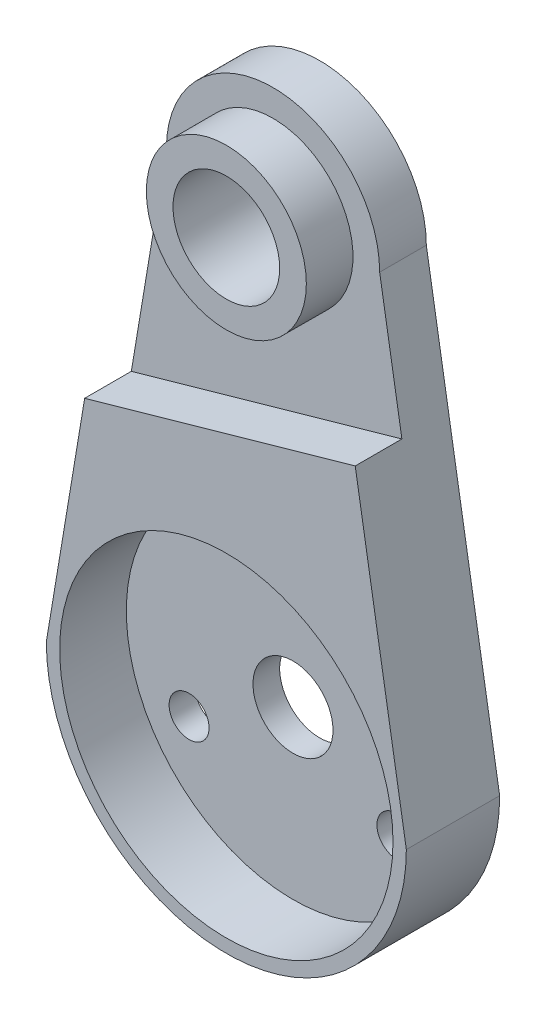
ISO-10303-21;
HEADER;
FILE_DESCRIPTION(('STEP AP214'),'2;1');
FILE_NAME('part.step','',(''),(''),'','','');
FILE_SCHEMA(('AUTOMOTIVE_DESIGN { 1 0 10303 214 1 1 1 1 }'));
ENDSEC;
DATA;
#1=APPLICATION_CONTEXT('core data for automotive mechanical design processes');
#2=APPLICATION_PROTOCOL_DEFINITION('international standard','automotive_design',2000,#1);
#3=PRODUCT_CONTEXT('',#1,'mechanical');
#4=PRODUCT('Part','Part','',(#3));
#5=PRODUCT_RELATED_PRODUCT_CATEGORY('part','',(#4));
#6=PRODUCT_DEFINITION_FORMATION('','',#4);
#7=PRODUCT_DEFINITION_CONTEXT('part definition',#1,'design');
#8=PRODUCT_DEFINITION('design','',#6,#7);
#9=PRODUCT_DEFINITION_SHAPE('','',#8);
#10=(LENGTH_UNIT() NAMED_UNIT(*) SI_UNIT(.MILLI.,.METRE.));
#11=(NAMED_UNIT(*) PLANE_ANGLE_UNIT() SI_UNIT($,.RADIAN.));
#12=(NAMED_UNIT(*) SI_UNIT($,.STERADIAN.) SOLID_ANGLE_UNIT());
#13=UNCERTAINTY_MEASURE_WITH_UNIT(LENGTH_MEASURE(1.E-05),#10,'distance_accuracy_value','');
#14=(GEOMETRIC_REPRESENTATION_CONTEXT(3) GLOBAL_UNCERTAINTY_ASSIGNED_CONTEXT((#13)) GLOBAL_UNIT_ASSIGNED_CONTEXT((#10,
#11,#12)) REPRESENTATION_CONTEXT('',''));
#15=CARTESIAN_POINT('',(0.,0.,0.));
#16=DIRECTION('',(0.,0.,1.));
#17=DIRECTION('',(1.,0.,0.));
#18=AXIS2_PLACEMENT_3D('',#15,#16,#17);
#19=CARTESIAN_POINT('',(0.,0.,7.));
#20=DIRECTION('',(0.,0.,-1.));
#21=DIRECTION('',(-1.,0.,0.));
#22=AXIS2_PLACEMENT_3D('',#19,#20,#21);
#23=PLANE('',#22);
#24=CARTESIAN_POINT('',(0.,-33.,7.));
#25=DIRECTION('',(0.,0.,1.));
#26=DIRECTION('',(1.,0.,0.));
#27=AXIS2_PLACEMENT_3D('',#24,#25,#26);
#28=CIRCLE('',#27,12.5);
#29=CARTESIAN_POINT('',(12.5,-33.,7.));
#30=VERTEX_POINT('',#29);
#31=EDGE_CURVE('E143',#30,#30,#28,.T.);
#32=ORIENTED_EDGE('',*,*,#31,.F.);
#33=EDGE_LOOP('',(#32));
#34=FACE_BOUND('',#33,.T.);
#35=DIRECTION('',(-0.164398987305357,0.986393923832144,0.));
#36=VECTOR('',#35,1.);
#37=CARTESIAN_POINT('',(8.,0.,7.));
#38=LINE('',#37,#36);
#39=CARTESIAN_POINT('',(13.5,-33.,7.));
#40=VERTEX_POINT('',#39);
#41=CARTESIAN_POINT('',(9.66666666666667,-10.,7.));
#42=VERTEX_POINT('',#41);
#43=EDGE_CURVE('E87',#40,#42,#38,.T.);
#44=ORIENTED_EDGE('',*,*,#43,.T.);
#45=DIRECTION('',(0.962118089877056,0.272633052162287,0.));
#46=VECTOR('',#45,1.);
#47=CARTESIAN_POINT('',(9.66666666666667,-10.,7.));
#48=LINE('',#47,#46);
#49=CARTESIAN_POINT('',(-10.625,-15.75,7.));
#50=VERTEX_POINT('',#49);
#51=EDGE_CURVE('E149',#50,#42,#48,.T.);
#52=ORIENTED_EDGE('',*,*,#51,.F.);
#53=DIRECTION('',(-0.164398987305357,-0.986393923832144,0.));
#54=VECTOR('',#53,1.);
#55=CARTESIAN_POINT('',(-8.,0.,7.));
#56=LINE('',#55,#54);
#57=CARTESIAN_POINT('',(-13.5,-33.,7.));
#58=VERTEX_POINT('',#57);
#59=EDGE_CURVE('E94',#50,#58,#56,.T.);
#60=ORIENTED_EDGE('',*,*,#59,.T.);
#61=CARTESIAN_POINT('',(0.,-33.,7.));
#62=DIRECTION('',(0.,0.,1.));
#63=DIRECTION('',(1.,0.,0.));
#64=AXIS2_PLACEMENT_3D('',#61,#62,#63);
#65=CIRCLE('',#64,13.5);
#66=EDGE_CURVE('E53',#58,#40,#65,.T.);
#67=ORIENTED_EDGE('',*,*,#66,.T.);
#68=EDGE_LOOP('',(#44,#52,#60,#67));
#69=FACE_BOUND('',#68,.T.);
#70=ADVANCED_FACE('F36',(#34,#69),#23,.F.);
#71=CARTESIAN_POINT('',(0.,-33.,0.));
#72=DIRECTION('',(0.,0.,1.));
#73=DIRECTION('',(1.,0.,0.));
#74=AXIS2_PLACEMENT_3D('',#71,#72,#73);
#75=CYLINDRICAL_SURFACE('',#74,3.);
#76=CARTESIAN_POINT('',(0.,-33.,0.));
#77=DIRECTION('',(0.,0.,1.));
#78=DIRECTION('',(1.,0.,0.));
#79=AXIS2_PLACEMENT_3D('',#76,#77,#78);
#80=CIRCLE('',#79,3.);
#81=CARTESIAN_POINT('',(3.00000000000001,-33.,0.));
#82=VERTEX_POINT('',#81);
#83=EDGE_CURVE('E99',#82,#82,#80,.T.);
#84=ORIENTED_EDGE('',*,*,#83,.F.);
#85=EDGE_LOOP('',(#84));
#86=FACE_BOUND('',#85,.T.);
#87=CARTESIAN_POINT('',(0.,-33.,2.));
#88=DIRECTION('',(0.,0.,1.));
#89=DIRECTION('',(1.,0.,0.));
#90=AXIS2_PLACEMENT_3D('',#87,#88,#89);
#91=CIRCLE('',#90,3.);
#92=CARTESIAN_POINT('',(3.00000000000001,-33.,2.));
#93=VERTEX_POINT('',#92);
#94=EDGE_CURVE('E177',#93,#93,#91,.F.);
#95=ORIENTED_EDGE('',*,*,#94,.F.);
#96=EDGE_LOOP('',(#95));
#97=FACE_BOUND('',#96,.T.);
#98=ADVANCED_FACE('F197',(#86,#97),#75,.F.);
#99=CARTESIAN_POINT('',(7.79422863405993,-37.5,0.));
#100=DIRECTION('',(0.,0.,1.));
#101=DIRECTION('',(1.,0.,0.));
#102=AXIS2_PLACEMENT_3D('',#99,#100,#101);
#103=CYLINDRICAL_SURFACE('',#102,1.5);
#104=CARTESIAN_POINT('',(7.79422863405993,-37.5,0.));
#105=DIRECTION('',(0.,0.,1.));
#106=DIRECTION('',(1.,0.,0.));
#107=AXIS2_PLACEMENT_3D('',#104,#105,#106);
#108=CIRCLE('',#107,1.5);
#109=CARTESIAN_POINT('',(9.29422863405993,-37.5,0.));
#110=VERTEX_POINT('',#109);
#111=EDGE_CURVE('E180',#110,#110,#108,.T.);
#112=ORIENTED_EDGE('',*,*,#111,.F.);
#113=EDGE_LOOP('',(#112));
#114=FACE_BOUND('',#113,.T.);
#115=CARTESIAN_POINT('',(7.79422863405993,-37.5,2.));
#116=DIRECTION('',(0.,0.,1.));
#117=DIRECTION('',(1.,0.,0.));
#118=AXIS2_PLACEMENT_3D('',#115,#116,#117);
#119=CIRCLE('',#118,1.5);
#120=CARTESIAN_POINT('',(9.29422863405993,-37.5,2.));
#121=VERTEX_POINT('',#120);
#122=EDGE_CURVE('E174',#121,#121,#119,.F.);
#123=ORIENTED_EDGE('',*,*,#122,.F.);
#124=EDGE_LOOP('',(#123));
#125=FACE_BOUND('',#124,.T.);
#126=ADVANCED_FACE('F203',(#114,#125),#103,.F.);
#127=CARTESIAN_POINT('',(-7.79422863405992,-37.5,0.));
#128=DIRECTION('',(0.,0.,1.));
#129=DIRECTION('',(1.,0.,0.));
#130=AXIS2_PLACEMENT_3D('',#127,#128,#129);
#131=CYLINDRICAL_SURFACE('',#130,1.5);
#132=CARTESIAN_POINT('',(-7.79422863405992,-37.5,0.));
#133=DIRECTION('',(0.,0.,1.));
#134=DIRECTION('',(1.,0.,0.));
#135=AXIS2_PLACEMENT_3D('',#132,#133,#134);
#136=CIRCLE('',#135,1.5);
#137=CARTESIAN_POINT('',(-6.29422863405992,-37.5,0.));
#138=VERTEX_POINT('',#137);
#139=EDGE_CURVE('E183',#138,#138,#136,.T.);
#140=ORIENTED_EDGE('',*,*,#139,.F.);
#141=EDGE_LOOP('',(#140));
#142=FACE_BOUND('',#141,.T.);
#143=CARTESIAN_POINT('',(-7.79422863405992,-37.5,2.));
#144=DIRECTION('',(0.,0.,1.));
#145=DIRECTION('',(1.,0.,0.));
#146=AXIS2_PLACEMENT_3D('',#143,#144,#145);
#147=CIRCLE('',#146,1.5);
#148=CARTESIAN_POINT('',(-6.29422863405992,-37.5,2.));
#149=VERTEX_POINT('',#148);
#150=EDGE_CURVE('E116',#149,#149,#147,.F.);
#151=ORIENTED_EDGE('',*,*,#150,.F.);
#152=EDGE_LOOP('',(#151));
#153=FACE_BOUND('',#152,.T.);
#154=ADVANCED_FACE('F233',(#142,#153),#131,.F.);
#155=CARTESIAN_POINT('',(0.,-24.,0.));
#156=DIRECTION('',(0.,0.,1.));
#157=DIRECTION('',(1.,0.,0.));
#158=AXIS2_PLACEMENT_3D('',#155,#156,#157);
#159=CYLINDRICAL_SURFACE('',#158,1.5);
#160=CARTESIAN_POINT('',(0.,-24.,0.));
#161=DIRECTION('',(0.,0.,1.));
#162=DIRECTION('',(1.,0.,0.));
#163=AXIS2_PLACEMENT_3D('',#160,#161,#162);
#164=CIRCLE('',#163,1.5);
#165=CARTESIAN_POINT('',(1.5,-24.,0.));
#166=VERTEX_POINT('',#165);
#167=EDGE_CURVE('E103',#166,#166,#164,.T.);
#168=ORIENTED_EDGE('',*,*,#167,.F.);
#169=EDGE_LOOP('',(#168));
#170=FACE_BOUND('',#169,.T.);
#171=CARTESIAN_POINT('',(0.,-24.,2.));
#172=DIRECTION('',(0.,0.,1.));
#173=DIRECTION('',(1.,0.,0.));
#174=AXIS2_PLACEMENT_3D('',#171,#172,#173);
#175=CIRCLE('',#174,1.5);
#176=CARTESIAN_POINT('',(1.5,-24.,2.));
#177=VERTEX_POINT('',#176);
#178=EDGE_CURVE('E114',#177,#177,#175,.F.);
#179=ORIENTED_EDGE('',*,*,#178,.F.);
#180=EDGE_LOOP('',(#179));
#181=FACE_BOUND('',#180,.T.);
#182=ADVANCED_FACE('F239',(#170,#181),#159,.F.);
#183=CARTESIAN_POINT('',(0.,0.,7.));
#184=DIRECTION('',(0.,0.,-1.));
#185=DIRECTION('',(-1.,0.,0.));
#186=AXIS2_PLACEMENT_3D('',#183,#184,#185);
#187=CYLINDRICAL_SURFACE('',#186,8.);
#188=DIRECTION('',(0.,0.,-1.));
#189=VECTOR('',#188,1.);
#190=CARTESIAN_POINT('',(-8.,0.,7.));
#191=LINE('',#190,#189);
#192=CARTESIAN_POINT('',(-8.,0.,3.5));
#193=VERTEX_POINT('',#192);
#194=CARTESIAN_POINT('',(-8.,0.,0.));
#195=VERTEX_POINT('',#194);
#196=EDGE_CURVE('E112',#193,#195,#191,.T.);
#197=ORIENTED_EDGE('',*,*,#196,.F.);
#198=CARTESIAN_POINT('',(0.,0.,3.5));
#199=DIRECTION('',(0.,0.,-1.));
#200=DIRECTION('',(-1.,0.,0.));
#201=AXIS2_PLACEMENT_3D('',#198,#199,#200);
#202=CIRCLE('',#201,8.);
#203=CARTESIAN_POINT('',(8.,0.,3.5));
#204=VERTEX_POINT('',#203);
#205=EDGE_CURVE('E83',#193,#204,#202,.T.);
#206=ORIENTED_EDGE('',*,*,#205,.T.);
#207=DIRECTION('',(0.,0.,-1.));
#208=VECTOR('',#207,1.);
#209=CARTESIAN_POINT('',(8.,0.,7.));
#210=LINE('',#209,#208);
#211=CARTESIAN_POINT('',(8.,0.,0.));
#212=VERTEX_POINT('',#211);
#213=EDGE_CURVE('E76',#204,#212,#210,.T.);
#214=ORIENTED_EDGE('',*,*,#213,.T.);
#215=CARTESIAN_POINT('',(0.,0.,0.));
#216=DIRECTION('',(0.,0.,1.));
#217=DIRECTION('',(-1.,0.,0.));
#218=AXIS2_PLACEMENT_3D('',#215,#216,#217);
#219=CIRCLE('',#218,8.);
#220=EDGE_CURVE('E80',#212,#195,#219,.T.);
#221=ORIENTED_EDGE('',*,*,#220,.T.);
#222=EDGE_LOOP('',(#197,#206,#214,#221));
#223=FACE_BOUND('',#222,.T.);
#224=ADVANCED_FACE('F38',(#223),#187,.T.);
#225=CARTESIAN_POINT('',(-8.,0.,7.));
#226=DIRECTION('',(0.986393923832144,-0.164398987305357,0.));
#227=DIRECTION('',(0.164398987305357,0.986393923832144,0.));
#228=AXIS2_PLACEMENT_3D('',#225,#226,#227);
#229=PLANE('',#228);
#230=ORIENTED_EDGE('',*,*,#59,.F.);
#231=DIRECTION('',(0.,0.,1.));
#232=VECTOR('',#231,1.);
#233=CARTESIAN_POINT('',(-10.625,-15.75,3.5));
#234=LINE('',#233,#232);
#235=CARTESIAN_POINT('',(-10.625,-15.75,3.5));
#236=VERTEX_POINT('',#235);
#237=EDGE_CURVE('E147',#236,#50,#234,.T.);
#238=ORIENTED_EDGE('',*,*,#237,.F.);
#239=DIRECTION('',(0.164398987305357,0.986393923832144,0.));
#240=VECTOR('',#239,1.);
#241=CARTESIAN_POINT('',(-8.,0.,3.5));
#242=LINE('',#241,#240);
#243=EDGE_CURVE('E140',#236,#193,#242,.T.);
#244=ORIENTED_EDGE('',*,*,#243,.T.);
#245=ORIENTED_EDGE('',*,*,#196,.T.);
#246=DIRECTION('',(-0.164398987305357,-0.986393923832144,0.));
#247=VECTOR('',#246,1.);
#248=CARTESIAN_POINT('',(-8.,0.,0.));
#249=LINE('',#248,#247);
#250=CARTESIAN_POINT('',(-13.5,-33.,0.));
#251=VERTEX_POINT('',#250);
#252=EDGE_CURVE('E98',#195,#251,#249,.T.);
#253=ORIENTED_EDGE('',*,*,#252,.T.);
#254=DIRECTION('',(0.,0.,-1.));
#255=VECTOR('',#254,1.);
#256=CARTESIAN_POINT('',(-13.5,-33.,7.));
#257=LINE('',#256,#255);
#258=EDGE_CURVE('E110',#58,#251,#257,.T.);
#259=ORIENTED_EDGE('',*,*,#258,.F.);
#260=EDGE_LOOP('',(#230,#238,#244,#245,#253,#259));
#261=FACE_BOUND('',#260,.T.);
#262=ADVANCED_FACE('F152',(#261),#229,.F.);
#263=CARTESIAN_POINT('',(0.,-33.,7.));
#264=DIRECTION('',(0.,0.,-1.));
#265=DIRECTION('',(-1.,0.,0.));
#266=AXIS2_PLACEMENT_3D('',#263,#264,#265);
#267=CYLINDRICAL_SURFACE('',#266,13.5);
#268=CARTESIAN_POINT('',(0.,-33.,0.));
#269=DIRECTION('',(0.,0.,1.));
#270=DIRECTION('',(1.,0.,0.));
#271=AXIS2_PLACEMENT_3D('',#268,#269,#270);
#272=CIRCLE('',#271,13.5);
#273=CARTESIAN_POINT('',(13.5,-33.,0.));
#274=VERTEX_POINT('',#273);
#275=EDGE_CURVE('E69',#251,#274,#272,.T.);
#276=ORIENTED_EDGE('',*,*,#275,.T.);
#277=DIRECTION('',(0.,0.,-1.));
#278=VECTOR('',#277,1.);
#279=CARTESIAN_POINT('',(13.5,-33.,7.));
#280=LINE('',#279,#278);
#281=EDGE_CURVE('E86',#40,#274,#280,.T.);
#282=ORIENTED_EDGE('',*,*,#281,.F.);
#283=ORIENTED_EDGE('',*,*,#66,.F.);
#284=ORIENTED_EDGE('',*,*,#258,.T.);
#285=EDGE_LOOP('',(#276,#282,#283,#284));
#286=FACE_BOUND('',#285,.T.);
#287=ADVANCED_FACE('F188',(#286),#267,.T.);
#288=CARTESIAN_POINT('',(8.,0.,7.));
#289=DIRECTION('',(-0.986393923832144,-0.164398987305357,0.));
#290=DIRECTION('',(0.164398987305357,-0.986393923832144,0.));
#291=AXIS2_PLACEMENT_3D('',#288,#289,#290);
#292=PLANE('',#291);
#293=ORIENTED_EDGE('',*,*,#213,.F.);
#294=DIRECTION('',(0.164398987305357,-0.986393923832144,0.));
#295=VECTOR('',#294,1.);
#296=CARTESIAN_POINT('',(8.,0.,3.5));
#297=LINE('',#296,#295);
#298=CARTESIAN_POINT('',(9.66666666666667,-10.,3.5));
#299=VERTEX_POINT('',#298);
#300=EDGE_CURVE('E45',#204,#299,#297,.T.);
#301=ORIENTED_EDGE('',*,*,#300,.T.);
#302=DIRECTION('',(0.,0.,-1.));
#303=VECTOR('',#302,1.);
#304=CARTESIAN_POINT('',(9.66666666666667,-10.,7.));
#305=LINE('',#304,#303);
#306=EDGE_CURVE('E123',#42,#299,#305,.T.);
#307=ORIENTED_EDGE('',*,*,#306,.F.);
#308=ORIENTED_EDGE('',*,*,#43,.F.);
#309=ORIENTED_EDGE('',*,*,#281,.T.);
#310=DIRECTION('',(-0.164398987305357,0.986393923832144,0.));
#311=VECTOR('',#310,1.);
#312=CARTESIAN_POINT('',(8.,0.,0.));
#313=LINE('',#312,#311);
#314=EDGE_CURVE('E90',#274,#212,#313,.T.);
#315=ORIENTED_EDGE('',*,*,#314,.T.);
#316=EDGE_LOOP('',(#293,#301,#307,#308,#309,#315));
#317=FACE_BOUND('',#316,.T.);
#318=ADVANCED_FACE('F91',(#317),#292,.F.);
#319=CARTESIAN_POINT('',(0.,0.,0.));
#320=DIRECTION('',(0.,0.,-1.));
#321=DIRECTION('',(-1.,0.,0.));
#322=AXIS2_PLACEMENT_3D('',#319,#320,#321);
#323=PLANE('',#322);
#324=CARTESIAN_POINT('',(0.,0.,0.));
#325=DIRECTION('',(0.,0.,1.));
#326=DIRECTION('',(1.,0.,0.));
#327=AXIS2_PLACEMENT_3D('',#324,#325,#326);
#328=CIRCLE('',#327,4.);
#329=CARTESIAN_POINT('',(4.,0.,0.));
#330=VERTEX_POINT('',#329);
#331=EDGE_CURVE('E157',#330,#330,#328,.T.);
#332=ORIENTED_EDGE('',*,*,#331,.T.);
#333=EDGE_LOOP('',(#332));
#334=FACE_BOUND('',#333,.T.);
#335=ORIENTED_EDGE('',*,*,#167,.T.);
#336=EDGE_LOOP('',(#335));
#337=FACE_BOUND('',#336,.T.);
#338=ORIENTED_EDGE('',*,*,#139,.T.);
#339=EDGE_LOOP('',(#338));
#340=FACE_BOUND('',#339,.T.);
#341=ORIENTED_EDGE('',*,*,#111,.T.);
#342=EDGE_LOOP('',(#341));
#343=FACE_BOUND('',#342,.T.);
#344=ORIENTED_EDGE('',*,*,#83,.T.);
#345=EDGE_LOOP('',(#344));
#346=FACE_BOUND('',#345,.T.);
#347=ORIENTED_EDGE('',*,*,#220,.F.);
#348=ORIENTED_EDGE('',*,*,#314,.F.);
#349=ORIENTED_EDGE('',*,*,#275,.F.);
#350=ORIENTED_EDGE('',*,*,#252,.F.);
#351=EDGE_LOOP('',(#347,#348,#349,#350));
#352=FACE_BOUND('',#351,.T.);
#353=ADVANCED_FACE('F97',(#334,#337,#340,#343,#346,#352),#323,.T.);
#354=CARTESIAN_POINT('',(0.,-33.,2.));
#355=DIRECTION('',(0.,0.,1.));
#356=DIRECTION('',(1.,0.,0.));
#357=AXIS2_PLACEMENT_3D('',#354,#355,#356);
#358=PLANE('',#357);
#359=CARTESIAN_POINT('',(0.,-33.,2.));
#360=DIRECTION('',(0.,0.,1.));
#361=DIRECTION('',(1.,0.,0.));
#362=AXIS2_PLACEMENT_3D('',#359,#360,#361);
#363=CIRCLE('',#362,12.5);
#364=CARTESIAN_POINT('',(12.5,-33.,2.));
#365=VERTEX_POINT('',#364);
#366=EDGE_CURVE('E117',#365,#365,#363,.T.);
#367=ORIENTED_EDGE('',*,*,#366,.T.);
#368=EDGE_LOOP('',(#367));
#369=FACE_BOUND('',#368,.T.);
#370=ORIENTED_EDGE('',*,*,#178,.T.);
#371=EDGE_LOOP('',(#370));
#372=FACE_BOUND('',#371,.T.);
#373=ORIENTED_EDGE('',*,*,#150,.T.);
#374=EDGE_LOOP('',(#373));
#375=FACE_BOUND('',#374,.T.);
#376=ORIENTED_EDGE('',*,*,#122,.T.);
#377=EDGE_LOOP('',(#376));
#378=FACE_BOUND('',#377,.T.);
#379=ORIENTED_EDGE('',*,*,#94,.T.);
#380=EDGE_LOOP('',(#379));
#381=FACE_BOUND('',#380,.T.);
#382=ADVANCED_FACE('F210',(#369,#372,#375,#378,#381),#358,.T.);
#383=CARTESIAN_POINT('',(0.,-33.,2.));
#384=DIRECTION('',(0.,0.,1.));
#385=DIRECTION('',(1.,0.,0.));
#386=AXIS2_PLACEMENT_3D('',#383,#384,#385);
#387=CYLINDRICAL_SURFACE('',#386,12.5);
#388=ORIENTED_EDGE('',*,*,#366,.F.);
#389=EDGE_LOOP('',(#388));
#390=FACE_BOUND('',#389,.T.);
#391=ORIENTED_EDGE('',*,*,#31,.T.);
#392=EDGE_LOOP('',(#391));
#393=FACE_BOUND('',#392,.T.);
#394=ADVANCED_FACE('F215',(#390,#393),#387,.F.);
#395=CARTESIAN_POINT('',(13.5,-10.,3.5));
#396=DIRECTION('',(0.,0.,-1.));
#397=DIRECTION('',(-1.,0.,0.));
#398=AXIS2_PLACEMENT_3D('',#395,#396,#397);
#399=PLANE('',#398);
#400=CARTESIAN_POINT('',(0.,0.,3.5));
#401=DIRECTION('',(0.,0.,-1.));
#402=DIRECTION('',(-1.,0.,0.));
#403=AXIS2_PLACEMENT_3D('',#400,#401,#402);
#404=CIRCLE('',#403,6.);
#405=CARTESIAN_POINT('',(-6.,0.,3.5));
#406=VERTEX_POINT('',#405);
#407=EDGE_CURVE('E11',#406,#406,#404,.F.);
#408=ORIENTED_EDGE('',*,*,#407,.F.);
#409=EDGE_LOOP('',(#408));
#410=FACE_BOUND('',#409,.T.);
#411=ORIENTED_EDGE('',*,*,#243,.F.);
#412=DIRECTION('',(0.962118089877056,0.272633052162287,0.));
#413=VECTOR('',#412,1.);
#414=CARTESIAN_POINT('',(9.66666666666667,-10.,3.5));
#415=LINE('',#414,#413);
#416=EDGE_CURVE('E132',#236,#299,#415,.T.);
#417=ORIENTED_EDGE('',*,*,#416,.T.);
#418=ORIENTED_EDGE('',*,*,#300,.F.);
#419=ORIENTED_EDGE('',*,*,#205,.F.);
#420=EDGE_LOOP('',(#411,#417,#418,#419));
#421=FACE_BOUND('',#420,.T.);
#422=ADVANCED_FACE('F129',(#410,#421),#399,.F.);
#423=CARTESIAN_POINT('',(0.,0.,7.));
#424=DIRECTION('',(0.,0.,-1.));
#425=DIRECTION('',(-1.,0.,0.));
#426=AXIS2_PLACEMENT_3D('',#423,#424,#425);
#427=CYLINDRICAL_SURFACE('',#426,6.);
#428=CARTESIAN_POINT('',(0.,0.,7.));
#429=DIRECTION('',(0.,0.,1.));
#430=DIRECTION('',(1.,0.,0.));
#431=AXIS2_PLACEMENT_3D('',#428,#429,#430);
#432=CIRCLE('',#431,6.);
#433=CARTESIAN_POINT('',(6.,0.,7.));
#434=VERTEX_POINT('',#433);
#435=EDGE_CURVE('E162',#434,#434,#432,.T.);
#436=ORIENTED_EDGE('',*,*,#435,.F.);
#437=EDGE_LOOP('',(#436));
#438=FACE_BOUND('',#437,.T.);
#439=ORIENTED_EDGE('',*,*,#407,.T.);
#440=EDGE_LOOP('',(#439));
#441=FACE_BOUND('',#440,.T.);
#442=ADVANCED_FACE('F251',(#438,#441),#427,.T.);
#443=CARTESIAN_POINT('',(0.,0.,7.));
#444=DIRECTION('',(0.,0.,1.));
#445=DIRECTION('',(1.,0.,0.));
#446=AXIS2_PLACEMENT_3D('',#443,#444,#445);
#447=PLANE('',#446);
#448=CARTESIAN_POINT('',(0.,0.,7.));
#449=DIRECTION('',(0.,0.,1.));
#450=DIRECTION('',(1.,0.,0.));
#451=AXIS2_PLACEMENT_3D('',#448,#449,#450);
#452=CIRCLE('',#451,4.);
#453=CARTESIAN_POINT('',(4.,0.,7.));
#454=VERTEX_POINT('',#453);
#455=EDGE_CURVE('E154',#454,#454,#452,.T.);
#456=ORIENTED_EDGE('',*,*,#455,.F.);
#457=EDGE_LOOP('',(#456));
#458=FACE_BOUND('',#457,.T.);
#459=ORIENTED_EDGE('',*,*,#435,.T.);
#460=EDGE_LOOP('',(#459));
#461=FACE_BOUND('',#460,.T.);
#462=ADVANCED_FACE('F255',(#458,#461),#447,.T.);
#463=CARTESIAN_POINT('',(0.,0.,0.));
#464=DIRECTION('',(0.,0.,1.));
#465=DIRECTION('',(1.,0.,0.));
#466=AXIS2_PLACEMENT_3D('',#463,#464,#465);
#467=CYLINDRICAL_SURFACE('',#466,4.);
#468=ORIENTED_EDGE('',*,*,#331,.F.);
#469=EDGE_LOOP('',(#468));
#470=FACE_BOUND('',#469,.T.);
#471=ORIENTED_EDGE('',*,*,#455,.T.);
#472=EDGE_LOOP('',(#471));
#473=FACE_BOUND('',#472,.T.);
#474=ADVANCED_FACE('F259',(#470,#473),#467,.F.);
#475=CARTESIAN_POINT('',(9.66666666666667,-10.,3.5));
#476=DIRECTION('',(0.272633052162287,-0.962118089877056,0.));
#477=DIRECTION('',(0.962118089877057,0.272633052162287,0.));
#478=AXIS2_PLACEMENT_3D('',#475,#476,#477);
#479=PLANE('',#478);
#480=ORIENTED_EDGE('',*,*,#51,.T.);
#481=ORIENTED_EDGE('',*,*,#306,.T.);
#482=ORIENTED_EDGE('',*,*,#416,.F.);
#483=ORIENTED_EDGE('',*,*,#237,.T.);
#484=EDGE_LOOP('',(#480,#481,#482,#483));
#485=FACE_BOUND('',#484,.T.);
#486=ADVANCED_FACE('F146',(#485),#479,.F.);
#487=CLOSED_SHELL('',(#70,#98,#126,#154,#182,#224,#262,#287,#318,#353,#382,#394,#422,#442,#462,
#474,#486));
#488=MANIFOLD_SOLID_BREP('B2',#487);
#489=ADVANCED_BREP_SHAPE_REPRESENTATION('',(#18,#488),#14);
#490=SHAPE_DEFINITION_REPRESENTATION(#9,#489);
ENDSEC;
END-ISO-10303-21;
